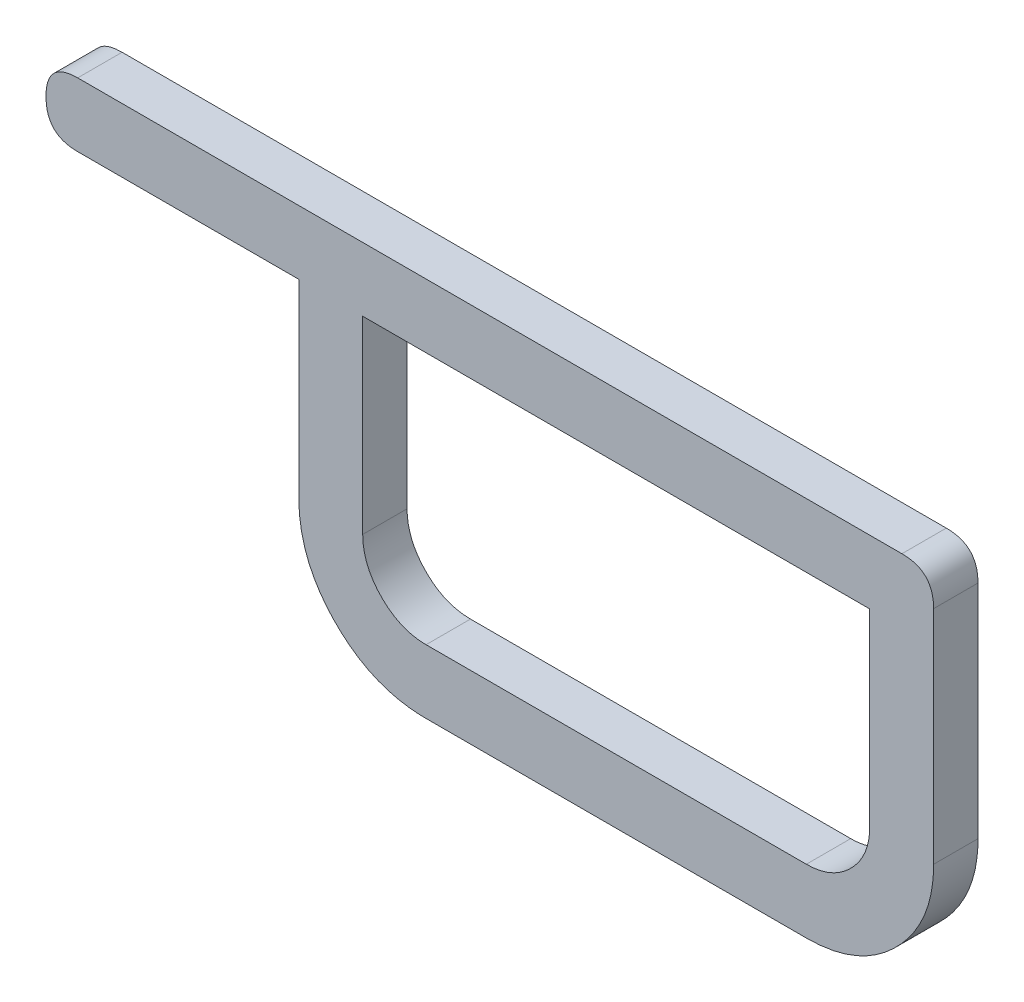
ISO-10303-21;
HEADER;
FILE_DESCRIPTION(('STEP AP214'),'2;1');
FILE_NAME('part.step','',(''),(''),'','','');
FILE_SCHEMA(('AUTOMOTIVE_DESIGN { 1 0 10303 214 1 1 1 1 }'));
ENDSEC;
DATA;
#1=APPLICATION_CONTEXT('core data for automotive mechanical design processes');
#2=APPLICATION_PROTOCOL_DEFINITION('international standard','automotive_design',2000,#1);
#3=PRODUCT_CONTEXT('',#1,'mechanical');
#4=PRODUCT('Part','Part','',(#3));
#5=PRODUCT_RELATED_PRODUCT_CATEGORY('part','',(#4));
#6=PRODUCT_DEFINITION_FORMATION('','',#4);
#7=PRODUCT_DEFINITION_CONTEXT('part definition',#1,'design');
#8=PRODUCT_DEFINITION('design','',#6,#7);
#9=PRODUCT_DEFINITION_SHAPE('','',#8);
#10=(LENGTH_UNIT() NAMED_UNIT(*) SI_UNIT(.MILLI.,.METRE.));
#11=(NAMED_UNIT(*) PLANE_ANGLE_UNIT() SI_UNIT($,.RADIAN.));
#12=(NAMED_UNIT(*) SI_UNIT($,.STERADIAN.) SOLID_ANGLE_UNIT());
#13=UNCERTAINTY_MEASURE_WITH_UNIT(LENGTH_MEASURE(1.E-05),#10,'distance_accuracy_value','');
#14=(GEOMETRIC_REPRESENTATION_CONTEXT(3) GLOBAL_UNCERTAINTY_ASSIGNED_CONTEXT((#13)) GLOBAL_UNIT_ASSIGNED_CONTEXT((#10,
#11,#12)) REPRESENTATION_CONTEXT('',''));
#15=CARTESIAN_POINT('',(0.,0.,0.));
#16=DIRECTION('',(0.,0.,1.));
#17=DIRECTION('',(1.,0.,0.));
#18=AXIS2_PLACEMENT_3D('',#15,#16,#17);
#19=CARTESIAN_POINT('',(0.8,12.2,-2.6));
#20=DIRECTION('',(0.,0.,1.));
#21=DIRECTION('',(1.,0.,0.));
#22=AXIS2_PLACEMENT_3D('',#19,#20,#21);
#23=PLANE('',#22);
#24=CARTESIAN_POINT('',(-2.29855,15.1828,-2.6));
#25=CARTESIAN_POINT('',(-2.37,15.1828,-2.6));
#26=CARTESIAN_POINT('',(-2.37,15.1108,-2.6));
#27=B_SPLINE_CURVE_WITH_KNOTS('',2,(#24,#25,#26),.UNSPECIFIED.,.F.,.F.,(3,3),(0.,1.),.UNSPECIFIED.);
#28=CARTESIAN_POINT('',(-2.29855,15.1828,-2.6));
#29=VERTEX_POINT('',#28);
#30=CARTESIAN_POINT('',(-2.37,15.1108,-2.6));
#31=VERTEX_POINT('',#30);
#32=EDGE_CURVE('E124',#29,#31,#27,.T.);
#33=ORIENTED_EDGE('',*,*,#32,.T.);
#34=CARTESIAN_POINT('',(-2.37,15.1108,-2.6));
#35=CARTESIAN_POINT('',(-2.37,15.0388,-2.6));
#36=CARTESIAN_POINT('',(-2.2988,15.0388,-2.6));
#37=B_SPLINE_CURVE_WITH_KNOTS('',2,(#34,#35,#36),.UNSPECIFIED.,.F.,.F.,(3,3),(0.,1.),.UNSPECIFIED.);
#38=CARTESIAN_POINT('',(-2.2988,15.0388,-2.6));
#39=VERTEX_POINT('',#38);
#40=EDGE_CURVE('E157',#31,#39,#37,.T.);
#41=ORIENTED_EDGE('',*,*,#40,.T.);
#42=DIRECTION('',(1.,0.,0.));
#43=VECTOR('',#42,1.);
#44=CARTESIAN_POINT('',(0.8,15.0388,-2.6));
#45=LINE('',#44,#43);
#46=CARTESIAN_POINT('',(-1.8004,15.0388,-2.6));
#47=VERTEX_POINT('',#46);
#48=EDGE_CURVE('E129',#39,#47,#45,.T.);
#49=ORIENTED_EDGE('',*,*,#48,.T.);
#50=DIRECTION('',(0.,1.,0.));
#51=VECTOR('',#50,1.);
#52=CARTESIAN_POINT('',(-1.8004,15.0388,-2.6));
#53=LINE('',#52,#51);
#54=CARTESIAN_POINT('',(-1.8004,14.61205,-2.6));
#55=VERTEX_POINT('',#54);
#56=EDGE_CURVE('E170',#55,#47,#53,.T.);
#57=ORIENTED_EDGE('',*,*,#56,.F.);
#58=CARTESIAN_POINT('',(-1.8004,14.61205,-2.6));
#59=CARTESIAN_POINT('',(-1.8003998160036,14.6035355597443,-2.6));
#60=CARTESIAN_POINT('',(-1.80008256894422,14.5950214754194,-2.6));
#61=CARTESIAN_POINT('',(-1.79875661173427,14.5780379098975,-2.6));
#62=CARTESIAN_POINT('',(-1.79774707563878,14.5695684941687,-2.6));
#63=CARTESIAN_POINT('',(-1.79361671377079,14.5444567670765,-2.6));
#64=CARTESIAN_POINT('',(-1.78939584211348,14.5279746814634,-2.6));
#65=CARTESIAN_POINT('',(-1.77799965765558,14.4964522412494,-2.6));
#66=CARTESIAN_POINT('',(-1.7708867763884,14.4813892353234,-2.6));
#67=CARTESIAN_POINT('',(-1.75400037887594,14.4528075001893,-2.6));
#68=CARTESIAN_POINT('',(-1.74422244868088,14.4392913862038,-2.6));
#69=CARTESIAN_POINT('',(-1.72840337674099,14.4208366863013,-2.6));
#70=CARTESIAN_POINT('',(-1.72316641905737,14.415181867946,-2.6));
#71=CARTESIAN_POINT('',(-1.71231137329343,14.4042505356049,-2.6));
#72=CARTESIAN_POINT('',(-1.70669329803749,14.398974008902,-2.6));
#73=CARTESIAN_POINT('',(-1.68928089086653,14.3838067764977,-2.6));
#74=CARTESIAN_POINT('',(-1.67691065226227,14.3745575977678,-2.6));
#75=CARTESIAN_POINT('',(-1.64928361736326,14.3573394435046,-2.6));
#76=CARTESIAN_POINT('',(-1.63385850605413,14.3496371992719,-2.6));
#77=CARTESIAN_POINT('',(-1.60179479731174,14.3373848225435,-2.6));
#78=CARTESIAN_POINT('',(-1.58515584095826,14.3328356265779,-2.6));
#79=CARTESIAN_POINT('',(-1.55935251132363,14.3282397918322,-2.6));
#80=CARTESIAN_POINT('',(-1.55036616399614,14.3270814560331,-2.6));
#81=CARTESIAN_POINT('',(-1.53235285673791,14.3255625670696,-2.6));
#82=CARTESIAN_POINT('',(-1.5233261039509,14.3251995940976,-2.6));
#83=CARTESIAN_POINT('',(-1.5143,14.3252,-2.6));
#84=B_SPLINE_CURVE_WITH_KNOTS('',3,(#58,#59,#60,#61,#62,#63,#64,#65,#66,#67,#68,#69,#70,#71,#72,
#73,#74,#75,#76,#77,#78,#79,#80,#81,#82,#83),.UNSPECIFIED.,.F.,.F.,(4,2,2,2,2,2,2,2,2,2,2,2,4),
(0.,0.0255340496383772,0.0510986161469163,0.101824109185629,0.151508242883679,0.201275170586227,
0.224382212820726,0.247488477901438,0.293619747328286,0.345017951748314,0.396431416120824,
0.423583122784671,0.450652107875788),.UNSPECIFIED.);
#85=CARTESIAN_POINT('',(-1.5143,14.3252,-2.6));
#86=VERTEX_POINT('',#85);
#87=EDGE_CURVE('E270',#55,#86,#84,.T.);
#88=ORIENTED_EDGE('',*,*,#87,.T.);
#89=DIRECTION('',(1.,0.,0.));
#90=VECTOR('',#89,1.);
#91=CARTESIAN_POINT('',(-1.5143,14.3252,-2.6));
#92=LINE('',#91,#90);
#93=CARTESIAN_POINT('',(-0.6561,14.3252,-2.6));
#94=VERTEX_POINT('',#93);
#95=EDGE_CURVE('E177',#94,#86,#92,.F.);
#96=ORIENTED_EDGE('',*,*,#95,.F.);
#97=CARTESIAN_POINT('',(-0.6561,14.3252,-2.6));
#98=CARTESIAN_POINT('',(-0.647572778144209,14.3252000561636,-2.6));
#99=CARTESIAN_POINT('',(-0.639045965234395,14.3255268744424,-2.6));
#100=CARTESIAN_POINT('',(-0.622040287620238,14.3268906519721,-2.6));
#101=CARTESIAN_POINT('',(-0.61356148937729,14.3279284279174,-2.6));
#102=CARTESIAN_POINT('',(-0.588450828285685,14.3321664087816,-2.6));
#103=CARTESIAN_POINT('',(-0.571987246050862,14.3364893415332,-2.6));
#104=CARTESIAN_POINT('',(-0.540854638533254,14.3479931581922,-2.6));
#105=CARTESIAN_POINT('',(-0.526139983185674,14.3550515171116,-2.6));
#106=CARTESIAN_POINT('',(-0.498196401099325,14.3717120449372,-2.6));
#107=CARTESIAN_POINT('',(-0.484970414481213,14.3813191262286,-2.6));
#108=CARTESIAN_POINT('',(-0.466758998753157,14.3969179668463,-2.6));
#109=CARTESIAN_POINT('',(-0.461099700776292,14.4021517908307,-2.6));
#110=CARTESIAN_POINT('',(-0.450154257282062,14.4129963292577,-2.6));
#111=CARTESIAN_POINT('',(-0.444868107967848,14.4186070398644,-2.6));
#112=CARTESIAN_POINT('',(-0.429658261759615,14.4359890799039,-2.6));
#113=CARTESIAN_POINT('',(-0.420363424120729,14.4483271404886,-2.6));
#114=CARTESIAN_POINT('',(-0.402876913546391,14.4760929428489,-2.6));
#115=CARTESIAN_POINT('',(-0.394987516400341,14.4917137670461,-2.6));
#116=CARTESIAN_POINT('',(-0.382434218897972,14.5242094111531,-2.6));
#117=CARTESIAN_POINT('',(-0.377770783844724,14.5410844115728,-2.6));
#118=CARTESIAN_POINT('',(-0.373084941673606,14.5671829030551,-2.6));
#119=CARTESIAN_POINT('',(-0.37190991526476,14.5762202778483,-2.6));
#120=CARTESIAN_POINT('',(-0.370368361466423,14.594338737871,-2.6));
#121=CARTESIAN_POINT('',(-0.369999534545718,14.6034196245429,-2.6));
#122=CARTESIAN_POINT('',(-0.37,14.6125,-2.6));
#123=B_SPLINE_CURVE_WITH_KNOTS('',3,(#97,#98,#99,#100,#101,#102,#103,#104,#105,#106,#107,#108,
#109,#110,#111,#112,#113,#114,#115,#116,#117,#118,#119,#120,#121,#122),.UNSPECIFIED.,.F.,.F.,(4,
2,2,2,2,2,2,2,2,2,2,2,4),(0.,0.0255718736627873,0.0511731717271448,0.10190976679518,
0.15059647618004,0.199377714371063,0.222488408395358,0.245598867230646,0.291742676741532,
0.343908506876982,0.396081859686895,0.423391183850599,0.450622511140521),.UNSPECIFIED.);
#124=CARTESIAN_POINT('',(-0.37,14.6125,-2.6));
#125=VERTEX_POINT('',#124);
#126=EDGE_CURVE('E293',#94,#125,#123,.T.);
#127=ORIENTED_EDGE('',*,*,#126,.T.);
#128=DIRECTION('',(0.,1.,0.));
#129=VECTOR('',#128,1.);
#130=CARTESIAN_POINT('',(-0.37,14.6125,-2.6));
#131=LINE('',#130,#129);
#132=CARTESIAN_POINT('',(-0.37,15.11135,-2.6));
#133=VERTEX_POINT('',#132);
#134=EDGE_CURVE('E298',#133,#125,#131,.F.);
#135=ORIENTED_EDGE('',*,*,#134,.F.);
#136=CARTESIAN_POINT('',(-0.37,15.11135,-2.6));
#137=CARTESIAN_POINT('',(-0.37,15.1828,-2.6));
#138=CARTESIAN_POINT('',(-0.44145,15.1828,-2.6));
#139=B_SPLINE_CURVE_WITH_KNOTS('',2,(#136,#137,#138),.UNSPECIFIED.,.F.,.F.,(3,3),(0.,1.),.UNSPECIFIED.);
#140=CARTESIAN_POINT('',(-0.44145,15.1828,-2.6));
#141=VERTEX_POINT('',#140);
#142=EDGE_CURVE('E287',#133,#141,#139,.T.);
#143=ORIENTED_EDGE('',*,*,#142,.T.);
#144=DIRECTION('',(1.,0.,0.));
#145=VECTOR('',#144,1.);
#146=CARTESIAN_POINT('',(-0.44145,15.1828,-2.6));
#147=LINE('',#146,#145);
#148=EDGE_CURVE('E330',#29,#141,#147,.T.);
#149=ORIENTED_EDGE('',*,*,#148,.F.);
#150=EDGE_LOOP('',(#33,#41,#49,#57,#88,#96,#127,#135,#143,#149));
#151=FACE_BOUND('',#150,.T.);
#152=DIRECTION('',(1.,0.,0.));
#153=VECTOR('',#152,1.);
#154=CARTESIAN_POINT('',(-0.6568,14.4692,-2.6));
#155=LINE('',#154,#153);
#156=CARTESIAN_POINT('',(-0.6568,14.4692,-2.6));
#157=VERTEX_POINT('',#156);
#158=CARTESIAN_POINT('',(-1.5136,14.4692,-2.6));
#159=VERTEX_POINT('',#158);
#160=EDGE_CURVE('E183',#157,#159,#155,.F.);
#161=ORIENTED_EDGE('',*,*,#160,.T.);
#162=CARTESIAN_POINT('',(-1.6564,14.613,-2.6));
#163=CARTESIAN_POINT('',(-1.65643513674415,14.6044647302951,-2.6));
#164=CARTESIAN_POINT('',(-1.65572803096606,14.5959057944378,-2.6));
#165=CARTESIAN_POINT('',(-1.65280284789136,14.5791376703585,-2.6));
#166=CARTESIAN_POINT('',(-1.65059927865323,14.5709259209587,-2.6));
#167=CARTESIAN_POINT('',(-1.64482017390128,14.5555100075264,-2.6));
#168=CARTESIAN_POINT('',(-1.64132676290647,14.5482752668035,-2.6));
#169=CARTESIAN_POINT('',(-1.6331390104382,14.5345057855089,-2.6));
#170=CARTESIAN_POINT('',(-1.62844129241897,14.5279730875755,-2.6));
#171=CARTESIAN_POINT('',(-1.61820179251674,14.51574075117,-2.6));
#172=CARTESIAN_POINT('',(-1.61266989787803,14.5100327146888,-2.6));
#173=CARTESIAN_POINT('',(-1.60084315572948,14.4994804329752,-2.6));
#174=CARTESIAN_POINT('',(-1.59454972690608,14.4946346218622,-2.6));
#175=CARTESIAN_POINT('',(-1.58157785899682,14.4863282206529,-2.6));
#176=CARTESIAN_POINT('',(-1.57493898512848,14.4828066181307,-2.6));
#177=CARTESIAN_POINT('',(-1.56115162547525,14.4769572020059,-2.6));
#178=CARTESIAN_POINT('',(-1.55400313022343,14.4746294105865,-2.6));
#179=CARTESIAN_POINT('',(-1.54129354071733,14.4716451266859,-2.6));
#180=CARTESIAN_POINT('',(-1.53579427650218,14.4707134004504,-2.6));
#181=CARTESIAN_POINT('',(-1.52472830693292,14.4694891756846,-2.6));
#182=CARTESIAN_POINT('',(-1.51916165655574,14.4691961872936,-2.6));
#183=CARTESIAN_POINT('',(-1.5136,14.4692,-2.6));
#184=B_SPLINE_CURVE_WITH_KNOTS('',3,(#162,#163,#164,#165,#166,#167,#168,#169,#170,#171,#172,
#173,#174,#175,#176,#177,#178,#179,#180,#181,#182,#183),.UNSPECIFIED.,.F.,.F.,(4,2,2,2,2,2,2,2,
2,2,4),(0.,0.0256082379951683,0.0509716856621924,0.0749401346436853,0.0989765338777531,
0.122747667284913,0.146475179423879,0.168912000572327,0.191349238624935,0.20804556643246,
0.224729084981592),.UNSPECIFIED.);
#185=CARTESIAN_POINT('',(-1.6564,14.613,-2.6));
#186=VERTEX_POINT('',#185);
#187=EDGE_CURVE('E169',#186,#159,#184,.T.);
#188=ORIENTED_EDGE('',*,*,#187,.F.);
#189=DIRECTION('',(0.,1.,0.));
#190=VECTOR('',#189,1.);
#191=CARTESIAN_POINT('',(-1.6564,14.613,-2.6));
#192=LINE('',#191,#190);
#193=CARTESIAN_POINT('',(-1.6564,15.0388,-2.6));
#194=VERTEX_POINT('',#193);
#195=EDGE_CURVE('E162',#186,#194,#192,.T.);
#196=ORIENTED_EDGE('',*,*,#195,.T.);
#197=DIRECTION('',(1.,0.,0.));
#198=VECTOR('',#197,1.);
#199=CARTESIAN_POINT('',(-1.6564,15.0388,-2.6));
#200=LINE('',#199,#198);
#201=CARTESIAN_POINT('',(-0.514,15.0388,-2.6));
#202=VERTEX_POINT('',#201);
#203=EDGE_CURVE('E147',#194,#202,#200,.T.);
#204=ORIENTED_EDGE('',*,*,#203,.T.);
#205=DIRECTION('',(0.,1.,0.));
#206=VECTOR('',#205,1.);
#207=CARTESIAN_POINT('',(-0.514,15.0388,-2.6));
#208=LINE('',#207,#206);
#209=CARTESIAN_POINT('',(-0.514,14.613,-2.6));
#210=VERTEX_POINT('',#209);
#211=EDGE_CURVE('E186',#202,#210,#208,.F.);
#212=ORIENTED_EDGE('',*,*,#211,.T.);
#213=CARTESIAN_POINT('',(-0.6568,14.4692,-2.6));
#214=CARTESIAN_POINT('',(-0.648261517372487,14.4691635336351,-2.6));
#215=CARTESIAN_POINT('',(-0.639696075160038,14.4698772336722,-2.6));
#216=CARTESIAN_POINT('',(-0.62292324950456,14.4728395746125,-2.6));
#217=CARTESIAN_POINT('',(-0.614713219379232,14.4750734246304,-2.6));
#218=CARTESIAN_POINT('',(-0.59943195082938,14.4809003734663,-2.6));
#219=CARTESIAN_POINT('',(-0.592321224441758,14.484389226148,-2.6));
#220=CARTESIAN_POINT('',(-0.578806190092339,14.492553156327,-2.6));
#221=CARTESIAN_POINT('',(-0.57240356957183,14.497230983348,-2.6));
#222=CARTESIAN_POINT('',(-0.560497359652889,14.5073775542678,-2.6));
#223=CARTESIAN_POINT('',(-0.554978076537108,14.5128281890234,-2.6));
#224=CARTESIAN_POINT('',(-0.544738458427463,14.52443247426,-2.6));
#225=CARTESIAN_POINT('',(-0.54001756732528,14.5305856303642,-2.6));
#226=CARTESIAN_POINT('',(-0.530951587709443,14.5446626759407,-2.6));
#227=CARTESIAN_POINT('',(-0.52679550128536,14.5527114190509,-2.6));
#228=CARTESIAN_POINT('',(-0.520209179505941,14.5694851152444,-2.6));
#229=CARTESIAN_POINT('',(-0.517777864903136,14.5782096416692,-2.6));
#230=CARTESIAN_POINT('',(-0.515457053607278,14.5913544034326,-2.6));
#231=CARTESIAN_POINT('',(-0.514903311253143,14.5956697180538,-2.6));
#232=CARTESIAN_POINT('',(-0.51417515471615,14.604323295216,-2.6));
#233=CARTESIAN_POINT('',(-0.513999926399915,14.608661488346,-2.6));
#234=CARTESIAN_POINT('',(-0.514,14.613,-2.6));
#235=B_SPLINE_CURVE_WITH_KNOTS('',3,(#213,#214,#215,#216,#217,#218,#219,#220,#221,#222,#223,
#224,#225,#226,#227,#228,#229,#230,#231,#232,#233,#234),.UNSPECIFIED.,.F.,.F.,(4,2,2,2,2,2,2,2,
2,2,4),(0.,0.0256224354924312,0.0509990663769163,0.0746274096820793,0.0983108991317701,
0.121510576926791,0.144694028168843,0.171684350607085,0.1986577693644,0.211695834556979,
0.224705828565297),.UNSPECIFIED.);
#236=EDGE_CURVE('E23',#157,#210,#235,.T.);
#237=ORIENTED_EDGE('',*,*,#236,.F.);
#238=EDGE_LOOP('',(#161,#188,#196,#204,#212,#237));
#239=FACE_BOUND('',#238,.T.);
#240=ADVANCED_FACE('F17',(#151,#239),#23,.T.);
#241=CARTESIAN_POINT('',(-1.6564,15.0388,-2.7));
#242=DIRECTION('',(0.,1.,0.));
#243=DIRECTION('',(0.,0.,1.));
#244=AXIS2_PLACEMENT_3D('',#241,#242,#243);
#245=PLANE('',#244);
#246=DIRECTION('',(0.,0.,1.));
#247=VECTOR('',#246,1.);
#248=CARTESIAN_POINT('',(-1.6564,15.0388,-2.7));
#249=LINE('',#248,#247);
#250=CARTESIAN_POINT('',(-1.6564,15.0388,-2.7));
#251=VERTEX_POINT('',#250);
#252=EDGE_CURVE('E150',#194,#251,#249,.F.);
#253=ORIENTED_EDGE('',*,*,#252,.T.);
#254=DIRECTION('',(1.,0.,0.));
#255=VECTOR('',#254,1.);
#256=CARTESIAN_POINT('',(0.8,15.0388,-2.7));
#257=LINE('',#256,#255);
#258=CARTESIAN_POINT('',(-0.514,15.0388,-2.7));
#259=VERTEX_POINT('',#258);
#260=EDGE_CURVE('E137',#251,#259,#257,.T.);
#261=ORIENTED_EDGE('',*,*,#260,.T.);
#262=DIRECTION('',(0.,0.,-1.));
#263=VECTOR('',#262,1.);
#264=CARTESIAN_POINT('',(-0.514,15.0388,-2.7));
#265=LINE('',#264,#263);
#266=EDGE_CURVE('E152',#259,#202,#265,.F.);
#267=ORIENTED_EDGE('',*,*,#266,.T.);
#268=ORIENTED_EDGE('',*,*,#203,.F.);
#269=EDGE_LOOP('',(#253,#261,#267,#268));
#270=FACE_BOUND('',#269,.T.);
#271=ADVANCED_FACE('F149',(#270),#245,.F.);
#272=CARTESIAN_POINT('',(-0.514,15.0388,-2.7));
#273=DIRECTION('',(1.,0.,0.));
#274=DIRECTION('',(0.,0.,-1.));
#275=AXIS2_PLACEMENT_3D('',#272,#273,#274);
#276=PLANE('',#275);
#277=ORIENTED_EDGE('',*,*,#266,.F.);
#278=DIRECTION('',(0.,1.,0.));
#279=VECTOR('',#278,1.);
#280=CARTESIAN_POINT('',(-0.514,12.2,-2.7));
#281=LINE('',#280,#279);
#282=CARTESIAN_POINT('',(-0.514,14.613,-2.7));
#283=VERTEX_POINT('',#282);
#284=EDGE_CURVE('E317',#259,#283,#281,.F.);
#285=ORIENTED_EDGE('',*,*,#284,.T.);
#286=DIRECTION('',(0.,0.,-1.));
#287=VECTOR('',#286,1.);
#288=CARTESIAN_POINT('',(-0.514,14.613,-2.65));
#289=LINE('',#288,#287);
#290=EDGE_CURVE('E324',#210,#283,#289,.T.);
#291=ORIENTED_EDGE('',*,*,#290,.F.);
#292=ORIENTED_EDGE('',*,*,#211,.F.);
#293=EDGE_LOOP('',(#277,#285,#291,#292));
#294=FACE_BOUND('',#293,.T.);
#295=ADVANCED_FACE('F420',(#294),#276,.F.);
#296=CARTESIAN_POINT('',(-0.6568,14.4692,-2.7));
#297=CARTESIAN_POINT('',(-0.59825,14.4692,-2.7));
#298=CARTESIAN_POINT('',(-0.514,14.55465,-2.7));
#299=CARTESIAN_POINT('',(-0.514,14.613,-2.7));
#300=CARTESIAN_POINT('',(-0.6568,14.4692,-2.6));
#301=CARTESIAN_POINT('',(-0.59825,14.4692,-2.6));
#302=CARTESIAN_POINT('',(-0.514,14.55465,-2.6));
#303=CARTESIAN_POINT('',(-0.514,14.613,-2.6));
#304=B_SPLINE_SURFACE_WITH_KNOTS('',1,2,((#296,#297,#298,#299),(#300,#301,#302,#303)),
.UNSPECIFIED.,.F.,.F.,.F.,(2,2),(3,1,3),(0.,1.),(0.,0.5,1.),.UNSPECIFIED.);
#305=CARTESIAN_POINT('',(-0.514,14.613,-2.7));
#306=CARTESIAN_POINT('',(-0.513964863255855,14.6044647302951,-2.7));
#307=CARTESIAN_POINT('',(-0.514671969033945,14.5959057944378,-2.7));
#308=CARTESIAN_POINT('',(-0.517597152108643,14.5791376703585,-2.7));
#309=CARTESIAN_POINT('',(-0.519800721346766,14.5709259209587,-2.7));
#310=CARTESIAN_POINT('',(-0.525579826098716,14.5555100075264,-2.7));
#311=CARTESIAN_POINT('',(-0.529073237093529,14.5482752668035,-2.7));
#312=CARTESIAN_POINT('',(-0.537260989561797,14.5345057855089,-2.7));
#313=CARTESIAN_POINT('',(-0.541958707581032,14.5279730875755,-2.7));
#314=CARTESIAN_POINT('',(-0.55219820748326,14.51574075117,-2.7));
#315=CARTESIAN_POINT('',(-0.557730102121966,14.5100327146888,-2.7));
#316=CARTESIAN_POINT('',(-0.569556844270525,14.4994804329752,-2.7));
#317=CARTESIAN_POINT('',(-0.575850273093921,14.4946346218622,-2.7));
#318=CARTESIAN_POINT('',(-0.588822141003186,14.4863282206529,-2.7));
#319=CARTESIAN_POINT('',(-0.595461014871526,14.4828066181307,-2.7));
#320=CARTESIAN_POINT('',(-0.60924837452475,14.4769572020059,-2.7));
#321=CARTESIAN_POINT('',(-0.616396869776567,14.4746294105865,-2.7));
#322=CARTESIAN_POINT('',(-0.629106459282669,14.4716451266859,-2.7));
#323=CARTESIAN_POINT('',(-0.634605723497818,14.4707134004504,-2.7));
#324=CARTESIAN_POINT('',(-0.645671693067083,14.4694891756847,-2.7));
#325=CARTESIAN_POINT('',(-0.651238343444259,14.4691961872936,-2.7));
#326=CARTESIAN_POINT('',(-0.6568,14.4692,-2.7));
#327=B_SPLINE_CURVE_WITH_KNOTS('',3,(#305,#306,#307,#308,#309,#310,#311,#312,#313,#314,#315,
#316,#317,#318,#319,#320,#321,#322,#323,#324,#325,#326),.UNSPECIFIED.,.F.,.F.,(4,2,2,2,2,2,2,2,
2,2,4),(0.,0.0256082379951684,0.0509716856621922,0.0749401346436842,0.0989765338777524,
0.122747667284915,0.146475179423882,0.168912000572329,0.191349238624936,0.208045566432461,
0.224729084981591),.UNSPECIFIED.);
#328=CARTESIAN_POINT('',(-0.6568,14.4692,-2.7));
#329=VERTEX_POINT('',#328);
#330=EDGE_CURVE('E240',#283,#329,#327,.T.);
#331=DIRECTION('',(0.,0.,-1.));
#332=VECTOR('',#331,1.);
#333=CARTESIAN_POINT('',(-0.6568,14.4692,-2.7));
#334=LINE('',#333,#332);
#335=EDGE_CURVE('E185',#329,#157,#334,.F.);
#336=ORIENTED_EDGE('',*,*,#330,.T.);
#337=ORIENTED_EDGE('',*,*,#335,.T.);
#338=ORIENTED_EDGE('',*,*,#236,.T.);
#339=ORIENTED_EDGE('',*,*,#290,.T.);
#340=EDGE_LOOP('',(#336,#337,#338,#339));
#341=FACE_BOUND('',#340,.T.);
#342=ADVANCED_FACE('F252',(#341),#304,.T.);
#343=CARTESIAN_POINT('',(-0.6568,14.4692,-2.7));
#344=DIRECTION('',(0.,-1.,0.));
#345=DIRECTION('',(0.,0.,-1.));
#346=AXIS2_PLACEMENT_3D('',#343,#344,#345);
#347=PLANE('',#346);
#348=ORIENTED_EDGE('',*,*,#335,.F.);
#349=DIRECTION('',(1.,0.,0.));
#350=VECTOR('',#349,1.);
#351=CARTESIAN_POINT('',(0.8,14.4692,-2.7));
#352=LINE('',#351,#350);
#353=CARTESIAN_POINT('',(-1.5136,14.4692,-2.7));
#354=VERTEX_POINT('',#353);
#355=EDGE_CURVE('E239',#329,#354,#352,.F.);
#356=ORIENTED_EDGE('',*,*,#355,.T.);
#357=DIRECTION('',(0.,0.,-1.));
#358=VECTOR('',#357,1.);
#359=CARTESIAN_POINT('',(-1.5136,14.4692,-2.65));
#360=LINE('',#359,#358);
#361=EDGE_CURVE('E166',#159,#354,#360,.T.);
#362=ORIENTED_EDGE('',*,*,#361,.F.);
#363=ORIENTED_EDGE('',*,*,#160,.F.);
#364=EDGE_LOOP('',(#348,#356,#362,#363));
#365=FACE_BOUND('',#364,.T.);
#366=ADVANCED_FACE('F250',(#365),#347,.F.);
#367=CARTESIAN_POINT('',(-1.6564,14.613,-2.7));
#368=CARTESIAN_POINT('',(-1.6564,14.55465,-2.7));
#369=CARTESIAN_POINT('',(-1.57215,14.4692,-2.7));
#370=CARTESIAN_POINT('',(-1.5136,14.4692,-2.7));
#371=CARTESIAN_POINT('',(-1.6564,14.613,-2.6));
#372=CARTESIAN_POINT('',(-1.6564,14.55465,-2.6));
#373=CARTESIAN_POINT('',(-1.57215,14.4692,-2.6));
#374=CARTESIAN_POINT('',(-1.5136,14.4692,-2.6));
#375=B_SPLINE_SURFACE_WITH_KNOTS('',1,2,((#367,#368,#369,#370),(#371,#372,#373,#374)),
.UNSPECIFIED.,.F.,.F.,.F.,(2,2),(3,1,3),(0.,1.),(0.,0.5,1.),.UNSPECIFIED.);
#376=CARTESIAN_POINT('',(-1.5136,14.4692,-2.7));
#377=CARTESIAN_POINT('',(-1.52213848262751,14.4691635336351,-2.7));
#378=CARTESIAN_POINT('',(-1.53070392483996,14.4698772336722,-2.7));
#379=CARTESIAN_POINT('',(-1.54747675049544,14.4728395746125,-2.7));
#380=CARTESIAN_POINT('',(-1.55568678062077,14.4750734246304,-2.7));
#381=CARTESIAN_POINT('',(-1.57096804917062,14.4809003734663,-2.7));
#382=CARTESIAN_POINT('',(-1.57807877555824,14.484389226148,-2.7));
#383=CARTESIAN_POINT('',(-1.59159380990767,14.492553156327,-2.7));
#384=CARTESIAN_POINT('',(-1.59799643042818,14.497230983348,-2.7));
#385=CARTESIAN_POINT('',(-1.60990264034712,14.5073775542678,-2.7));
#386=CARTESIAN_POINT('',(-1.61542192346289,14.5128281890234,-2.7));
#387=CARTESIAN_POINT('',(-1.62566154157254,14.52443247426,-2.7));
#388=CARTESIAN_POINT('',(-1.63038243267472,14.5305856303642,-2.7));
#389=CARTESIAN_POINT('',(-1.63944841229056,14.5446626759407,-2.7));
#390=CARTESIAN_POINT('',(-1.64360449871464,14.5527114190509,-2.7));
#391=CARTESIAN_POINT('',(-1.65019082049406,14.5694851152444,-2.7));
#392=CARTESIAN_POINT('',(-1.65262213509687,14.5782096416692,-2.7));
#393=CARTESIAN_POINT('',(-1.65494294639272,14.5913544034326,-2.7));
#394=CARTESIAN_POINT('',(-1.65549668874686,14.5956697180538,-2.7));
#395=CARTESIAN_POINT('',(-1.65622484528385,14.604323295216,-2.7));
#396=CARTESIAN_POINT('',(-1.65640007360008,14.608661488346,-2.7));
#397=CARTESIAN_POINT('',(-1.6564,14.613,-2.7));
#398=B_SPLINE_CURVE_WITH_KNOTS('',3,(#376,#377,#378,#379,#380,#381,#382,#383,#384,#385,#386,
#387,#388,#389,#390,#391,#392,#393,#394,#395,#396,#397),.UNSPECIFIED.,.F.,.F.,(4,2,2,2,2,2,2,2,
2,2,4),(0.,0.0256224354924312,0.050999066376916,0.074627409682083,0.0983108991317772,
0.121510576926796,0.144694028168843,0.171684350607084,0.198657769364398,0.211695834556976,
0.224705828565295),.UNSPECIFIED.);
#399=CARTESIAN_POINT('',(-1.6564,14.613,-2.7));
#400=VERTEX_POINT('',#399);
#401=EDGE_CURVE('E233',#354,#400,#398,.T.);
#402=DIRECTION('',(0.,0.,1.));
#403=VECTOR('',#402,1.);
#404=CARTESIAN_POINT('',(-1.6564,14.613,-2.7));
#405=LINE('',#404,#403);
#406=EDGE_CURVE('E165',#400,#186,#405,.T.);
#407=ORIENTED_EDGE('',*,*,#401,.T.);
#408=ORIENTED_EDGE('',*,*,#406,.T.);
#409=ORIENTED_EDGE('',*,*,#187,.T.);
#410=ORIENTED_EDGE('',*,*,#361,.T.);
#411=EDGE_LOOP('',(#407,#408,#409,#410));
#412=FACE_BOUND('',#411,.T.);
#413=ADVANCED_FACE('F245',(#412),#375,.T.);
#414=CARTESIAN_POINT('',(-1.6564,14.613,-2.7));
#415=DIRECTION('',(-1.,0.,0.));
#416=DIRECTION('',(0.,0.,1.));
#417=AXIS2_PLACEMENT_3D('',#414,#415,#416);
#418=PLANE('',#417);
#419=ORIENTED_EDGE('',*,*,#406,.F.);
#420=DIRECTION('',(0.,1.,0.));
#421=VECTOR('',#420,1.);
#422=CARTESIAN_POINT('',(-1.6564,12.2,-2.7));
#423=LINE('',#422,#421);
#424=EDGE_CURVE('E164',#400,#251,#423,.T.);
#425=ORIENTED_EDGE('',*,*,#424,.T.);
#426=ORIENTED_EDGE('',*,*,#252,.F.);
#427=ORIENTED_EDGE('',*,*,#195,.F.);
#428=EDGE_LOOP('',(#419,#425,#426,#427));
#429=FACE_BOUND('',#428,.T.);
#430=ADVANCED_FACE('F161',(#429),#418,.F.);
#431=CARTESIAN_POINT('',(-1.8004,15.0388,-2.7));
#432=DIRECTION('',(-1.,0.,0.));
#433=DIRECTION('',(0.,0.,1.));
#434=AXIS2_PLACEMENT_3D('',#431,#432,#433);
#435=PLANE('',#434);
#436=DIRECTION('',(0.,1.,0.));
#437=VECTOR('',#436,1.);
#438=CARTESIAN_POINT('',(-1.8004,12.2,-2.7));
#439=LINE('',#438,#437);
#440=CARTESIAN_POINT('',(-1.8004,15.0388,-2.7));
#441=VERTEX_POINT('',#440);
#442=CARTESIAN_POINT('',(-1.8004,14.61205,-2.7));
#443=VERTEX_POINT('',#442);
#444=EDGE_CURVE('E361',#441,#443,#439,.F.);
#445=ORIENTED_EDGE('',*,*,#444,.T.);
#446=DIRECTION('',(0.,0.,1.));
#447=VECTOR('',#446,1.);
#448=CARTESIAN_POINT('',(-1.8004,14.61205,-2.65));
#449=LINE('',#448,#447);
#450=EDGE_CURVE('E172',#443,#55,#449,.T.);
#451=ORIENTED_EDGE('',*,*,#450,.T.);
#452=ORIENTED_EDGE('',*,*,#56,.T.);
#453=DIRECTION('',(0.,0.,-1.));
#454=VECTOR('',#453,1.);
#455=CARTESIAN_POINT('',(-1.8004,15.0388,-2.7));
#456=LINE('',#455,#454);
#457=EDGE_CURVE('E318',#441,#47,#456,.F.);
#458=ORIENTED_EDGE('',*,*,#457,.F.);
#459=EDGE_LOOP('',(#445,#451,#452,#458));
#460=FACE_BOUND('',#459,.T.);
#461=ADVANCED_FACE('F395',(#460),#435,.T.);
#462=CARTESIAN_POINT('',(-1.8004,14.61205,-2.7));
#463=CARTESIAN_POINT('',(-1.8004,14.4922,-2.7));
#464=CARTESIAN_POINT('',(-1.63305,14.3252,-2.7));
#465=CARTESIAN_POINT('',(-1.5143,14.3252,-2.7));
#466=CARTESIAN_POINT('',(-1.8004,14.61205,-2.6));
#467=CARTESIAN_POINT('',(-1.8004,14.4922,-2.6));
#468=CARTESIAN_POINT('',(-1.63305,14.3252,-2.6));
#469=CARTESIAN_POINT('',(-1.5143,14.3252,-2.6));
#470=B_SPLINE_SURFACE_WITH_KNOTS('',1,2,((#462,#463,#464,#465),(#466,#467,#468,#469)),
.UNSPECIFIED.,.F.,.F.,.F.,(2,2),(3,1,3),(0.,1.),(0.,0.5,1.),.UNSPECIFIED.);
#471=CARTESIAN_POINT('',(-1.8004,14.61205,-2.7));
#472=CARTESIAN_POINT('',(-1.8003998160036,14.6035355597443,-2.7));
#473=CARTESIAN_POINT('',(-1.80008256894422,14.5950214754194,-2.7));
#474=CARTESIAN_POINT('',(-1.79875661173427,14.5780379098975,-2.7));
#475=CARTESIAN_POINT('',(-1.79774707563878,14.5695684941687,-2.7));
#476=CARTESIAN_POINT('',(-1.79361671377079,14.5444567670765,-2.7));
#477=CARTESIAN_POINT('',(-1.78939584211348,14.5279746814634,-2.7));
#478=CARTESIAN_POINT('',(-1.77799965765558,14.4964522412494,-2.7));
#479=CARTESIAN_POINT('',(-1.7708867763884,14.4813892353234,-2.7));
#480=CARTESIAN_POINT('',(-1.75400037887594,14.4528075001893,-2.7));
#481=CARTESIAN_POINT('',(-1.74422244868088,14.4392913862038,-2.7));
#482=CARTESIAN_POINT('',(-1.72840337674099,14.4208366863013,-2.7));
#483=CARTESIAN_POINT('',(-1.72316641905737,14.415181867946,-2.7));
#484=CARTESIAN_POINT('',(-1.71231137329342,14.4042505356049,-2.7));
#485=CARTESIAN_POINT('',(-1.70669329803749,14.398974008902,-2.7));
#486=CARTESIAN_POINT('',(-1.68928089086653,14.3838067764977,-2.7));
#487=CARTESIAN_POINT('',(-1.67691065226227,14.3745575977678,-2.7));
#488=CARTESIAN_POINT('',(-1.64928361736326,14.3573394435046,-2.7));
#489=CARTESIAN_POINT('',(-1.63385850605413,14.3496371992719,-2.7));
#490=CARTESIAN_POINT('',(-1.60179479731174,14.3373848225435,-2.7));
#491=CARTESIAN_POINT('',(-1.58515584095826,14.3328356265779,-2.7));
#492=CARTESIAN_POINT('',(-1.55935251132363,14.3282397918322,-2.7));
#493=CARTESIAN_POINT('',(-1.55036616399614,14.3270814560331,-2.7));
#494=CARTESIAN_POINT('',(-1.53235285673791,14.3255625670696,-2.7));
#495=CARTESIAN_POINT('',(-1.5233261039509,14.3251995940976,-2.7));
#496=CARTESIAN_POINT('',(-1.5143,14.3252,-2.7));
#497=B_SPLINE_CURVE_WITH_KNOTS('',3,(#471,#472,#473,#474,#475,#476,#477,#478,#479,#480,#481,
#482,#483,#484,#485,#486,#487,#488,#489,#490,#491,#492,#493,#494,#495,#496),.UNSPECIFIED.,.F.,
.F.,(4,2,2,2,2,2,2,2,2,2,2,2,4),(0.,0.0255340496383772,0.0510986161469163,0.101824109185629,
0.151508242883678,0.201275170586227,0.224382212820726,0.247488477901436,0.293619747328285,
0.345017951748313,0.396431416120823,0.42358312278467,0.450652107875787),.UNSPECIFIED.);
#498=CARTESIAN_POINT('',(-1.5143,14.3252,-2.7));
#499=VERTEX_POINT('',#498);
#500=EDGE_CURVE('E200',#443,#499,#497,.T.);
#501=DIRECTION('',(0.,0.,-1.));
#502=VECTOR('',#501,1.);
#503=CARTESIAN_POINT('',(-1.5143,14.3252,-2.7));
#504=LINE('',#503,#502);
#505=EDGE_CURVE('E304',#86,#499,#504,.T.);
#506=ORIENTED_EDGE('',*,*,#450,.F.);
#507=ORIENTED_EDGE('',*,*,#500,.T.);
#508=ORIENTED_EDGE('',*,*,#505,.F.);
#509=ORIENTED_EDGE('',*,*,#87,.F.);
#510=EDGE_LOOP('',(#506,#507,#508,#509));
#511=FACE_BOUND('',#510,.T.);
#512=ADVANCED_FACE('F256',(#511),#470,.F.);
#513=CARTESIAN_POINT('',(-1.5143,14.3252,-2.7));
#514=DIRECTION('',(0.,-1.,0.));
#515=DIRECTION('',(0.,0.,-1.));
#516=AXIS2_PLACEMENT_3D('',#513,#514,#515);
#517=PLANE('',#516);
#518=DIRECTION('',(1.,0.,0.));
#519=VECTOR('',#518,1.);
#520=CARTESIAN_POINT('',(0.8,14.3252,-2.7));
#521=LINE('',#520,#519);
#522=CARTESIAN_POINT('',(-0.6561,14.3252,-2.7));
#523=VERTEX_POINT('',#522);
#524=EDGE_CURVE('E199',#499,#523,#521,.T.);
#525=ORIENTED_EDGE('',*,*,#524,.T.);
#526=DIRECTION('',(0.,0.,1.));
#527=VECTOR('',#526,1.);
#528=CARTESIAN_POINT('',(-0.6561,14.3252,-2.65));
#529=LINE('',#528,#527);
#530=EDGE_CURVE('E299',#523,#94,#529,.T.);
#531=ORIENTED_EDGE('',*,*,#530,.T.);
#532=ORIENTED_EDGE('',*,*,#95,.T.);
#533=ORIENTED_EDGE('',*,*,#505,.T.);
#534=EDGE_LOOP('',(#525,#531,#532,#533));
#535=FACE_BOUND('',#534,.T.);
#536=ADVANCED_FACE('F387',(#535),#517,.T.);
#537=CARTESIAN_POINT('',(-0.6561,14.3252,-2.7));
#538=CARTESIAN_POINT('',(-0.53735,14.3252,-2.7));
#539=CARTESIAN_POINT('',(-0.37,14.49385,-2.7));
#540=CARTESIAN_POINT('',(-0.37,14.6125,-2.7));
#541=CARTESIAN_POINT('',(-0.6561,14.3252,-2.6));
#542=CARTESIAN_POINT('',(-0.53735,14.3252,-2.6));
#543=CARTESIAN_POINT('',(-0.37,14.49385,-2.6));
#544=CARTESIAN_POINT('',(-0.37,14.6125,-2.6));
#545=B_SPLINE_SURFACE_WITH_KNOTS('',1,2,((#537,#538,#539,#540),(#541,#542,#543,#544)),
.UNSPECIFIED.,.F.,.F.,.F.,(2,2),(3,1,3),(0.,1.),(0.,0.5,1.),.UNSPECIFIED.);
#546=CARTESIAN_POINT('',(-0.6561,14.3252,-2.7));
#547=CARTESIAN_POINT('',(-0.647572778144209,14.3252000561636,-2.7));
#548=CARTESIAN_POINT('',(-0.639045965234395,14.3255268744424,-2.7));
#549=CARTESIAN_POINT('',(-0.622040287620238,14.3268906519721,-2.7));
#550=CARTESIAN_POINT('',(-0.61356148937729,14.3279284279174,-2.7));
#551=CARTESIAN_POINT('',(-0.588450828285685,14.3321664087816,-2.7));
#552=CARTESIAN_POINT('',(-0.571987246050862,14.3364893415332,-2.7));
#553=CARTESIAN_POINT('',(-0.540854638533253,14.3479931581922,-2.7));
#554=CARTESIAN_POINT('',(-0.526139983185671,14.3550515171116,-2.7));
#555=CARTESIAN_POINT('',(-0.49819640109932,14.3717120449372,-2.7));
#556=CARTESIAN_POINT('',(-0.484970414481207,14.3813191262286,-2.7));
#557=CARTESIAN_POINT('',(-0.46675899875315,14.3969179668463,-2.7));
#558=CARTESIAN_POINT('',(-0.461099700776285,14.4021517908307,-2.7));
#559=CARTESIAN_POINT('',(-0.450154257282056,14.4129963292578,-2.7));
#560=CARTESIAN_POINT('',(-0.444868107967842,14.4186070398644,-2.7));
#561=CARTESIAN_POINT('',(-0.429658261759613,14.435989079904,-2.7));
#562=CARTESIAN_POINT('',(-0.420363424120728,14.4483271404886,-2.7));
#563=CARTESIAN_POINT('',(-0.402876913546391,14.4760929428489,-2.7));
#564=CARTESIAN_POINT('',(-0.39498751640034,14.4917137670461,-2.7));
#565=CARTESIAN_POINT('',(-0.382434218897971,14.5242094111531,-2.7));
#566=CARTESIAN_POINT('',(-0.377770783844723,14.5410844115728,-2.7));
#567=CARTESIAN_POINT('',(-0.373084941673606,14.5671829030551,-2.7));
#568=CARTESIAN_POINT('',(-0.37190991526476,14.5762202778483,-2.7));
#569=CARTESIAN_POINT('',(-0.370368361466422,14.594338737871,-2.7));
#570=CARTESIAN_POINT('',(-0.369999534545717,14.6034196245429,-2.7));
#571=CARTESIAN_POINT('',(-0.37,14.6125,-2.7));
#572=B_SPLINE_CURVE_WITH_KNOTS('',3,(#546,#547,#548,#549,#550,#551,#552,#553,#554,#555,#556,
#557,#558,#559,#560,#561,#562,#563,#564,#565,#566,#567,#568,#569,#570,#571),.UNSPECIFIED.,.F.,
.F.,(4,2,2,2,2,2,2,2,2,2,2,2,4),(0.,0.0255718736627875,0.0511731717271445,0.10190976679518,
0.150596476180044,0.199377714371073,0.222488408395367,0.245598867230651,0.291742676741531,
0.34390850687698,0.396081859686898,0.4233911838506,0.45062251114052),.UNSPECIFIED.);
#573=CARTESIAN_POINT('',(-0.37,14.6125,-2.7));
#574=VERTEX_POINT('',#573);
#575=EDGE_CURVE('E190',#523,#574,#572,.T.);
#576=DIRECTION('',(0.,0.,-1.));
#577=VECTOR('',#576,1.);
#578=CARTESIAN_POINT('',(-0.37,14.6125,-2.7));
#579=LINE('',#578,#577);
#580=EDGE_CURVE('E302',#125,#574,#579,.T.);
#581=ORIENTED_EDGE('',*,*,#530,.F.);
#582=ORIENTED_EDGE('',*,*,#575,.T.);
#583=ORIENTED_EDGE('',*,*,#580,.F.);
#584=ORIENTED_EDGE('',*,*,#126,.F.);
#585=EDGE_LOOP('',(#581,#582,#583,#584));
#586=FACE_BOUND('',#585,.T.);
#587=ADVANCED_FACE('F206',(#586),#545,.F.);
#588=CARTESIAN_POINT('',(-0.37,14.6125,-2.7));
#589=DIRECTION('',(1.,0.,0.));
#590=DIRECTION('',(0.,0.,-1.));
#591=AXIS2_PLACEMENT_3D('',#588,#589,#590);
#592=PLANE('',#591);
#593=DIRECTION('',(0.,1.,0.));
#594=VECTOR('',#593,1.);
#595=CARTESIAN_POINT('',(-0.37,12.2,-2.7));
#596=LINE('',#595,#594);
#597=CARTESIAN_POINT('',(-0.37,15.11135,-2.7));
#598=VERTEX_POINT('',#597);
#599=EDGE_CURVE('E198',#574,#598,#596,.T.);
#600=ORIENTED_EDGE('',*,*,#599,.T.);
#601=DIRECTION('',(0.,0.,1.));
#602=VECTOR('',#601,1.);
#603=CARTESIAN_POINT('',(-0.37,15.11135,-2.65));
#604=LINE('',#603,#602);
#605=EDGE_CURVE('E337',#598,#133,#604,.T.);
#606=ORIENTED_EDGE('',*,*,#605,.T.);
#607=ORIENTED_EDGE('',*,*,#134,.T.);
#608=ORIENTED_EDGE('',*,*,#580,.T.);
#609=EDGE_LOOP('',(#600,#606,#607,#608));
#610=FACE_BOUND('',#609,.T.);
#611=ADVANCED_FACE('F382',(#610),#592,.T.);
#612=CARTESIAN_POINT('',(-0.37,15.11135,-2.7));
#613=CARTESIAN_POINT('',(-0.37,15.1828,-2.7));
#614=CARTESIAN_POINT('',(-0.44145,15.1828,-2.7));
#615=CARTESIAN_POINT('',(-0.37,15.11135,-2.6));
#616=CARTESIAN_POINT('',(-0.37,15.1828,-2.6));
#617=CARTESIAN_POINT('',(-0.44145,15.1828,-2.6));
#618=B_SPLINE_SURFACE_WITH_KNOTS('',1,2,((#612,#613,#614),(#615,#616,#617)),.UNSPECIFIED.,.F.,
.F.,.F.,(2,2),(3,3),(0.,1.),(0.,1.),.UNSPECIFIED.);
#619=CARTESIAN_POINT('',(-0.37,15.11135,-2.7));
#620=CARTESIAN_POINT('',(-0.37,15.1828,-2.7));
#621=CARTESIAN_POINT('',(-0.44145,15.1828,-2.7));
#622=B_SPLINE_CURVE_WITH_KNOTS('',2,(#619,#620,#621),.UNSPECIFIED.,.F.,.F.,(3,3),(0.,1.),.UNSPECIFIED.);
#623=CARTESIAN_POINT('',(-0.44145,15.1828,-2.7));
#624=VERTEX_POINT('',#623);
#625=EDGE_CURVE('E227',#598,#624,#622,.T.);
#626=DIRECTION('',(0.,0.,1.));
#627=VECTOR('',#626,1.);
#628=CARTESIAN_POINT('',(-0.44145,15.1828,-2.7));
#629=LINE('',#628,#627);
#630=EDGE_CURVE('E331',#141,#624,#629,.F.);
#631=ORIENTED_EDGE('',*,*,#605,.F.);
#632=ORIENTED_EDGE('',*,*,#625,.T.);
#633=ORIENTED_EDGE('',*,*,#630,.F.);
#634=ORIENTED_EDGE('',*,*,#142,.F.);
#635=EDGE_LOOP('',(#631,#632,#633,#634));
#636=FACE_BOUND('',#635,.T.);
#637=ADVANCED_FACE('F377',(#636),#618,.F.);
#638=CARTESIAN_POINT('',(-0.44145,15.1828,-2.7));
#639=DIRECTION('',(0.,1.,0.));
#640=DIRECTION('',(0.,0.,1.));
#641=AXIS2_PLACEMENT_3D('',#638,#639,#640);
#642=PLANE('',#641);
#643=DIRECTION('',(1.,0.,0.));
#644=VECTOR('',#643,1.);
#645=CARTESIAN_POINT('',(0.8,15.1828,-2.7));
#646=LINE('',#645,#644);
#647=CARTESIAN_POINT('',(-2.29855,15.1828,-2.7));
#648=VERTEX_POINT('',#647);
#649=EDGE_CURVE('E368',#624,#648,#646,.F.);
#650=ORIENTED_EDGE('',*,*,#649,.T.);
#651=DIRECTION('',(0.,0.,1.));
#652=VECTOR('',#651,1.);
#653=CARTESIAN_POINT('',(-2.29855,15.1828,-2.65));
#654=LINE('',#653,#652);
#655=EDGE_CURVE('E335',#648,#29,#654,.T.);
#656=ORIENTED_EDGE('',*,*,#655,.T.);
#657=ORIENTED_EDGE('',*,*,#148,.T.);
#658=ORIENTED_EDGE('',*,*,#630,.T.);
#659=EDGE_LOOP('',(#650,#656,#657,#658));
#660=FACE_BOUND('',#659,.T.);
#661=ADVANCED_FACE('F402',(#660),#642,.T.);
#662=CARTESIAN_POINT('',(-2.29855,15.1828,-2.7));
#663=CARTESIAN_POINT('',(-2.37,15.1828,-2.7));
#664=CARTESIAN_POINT('',(-2.37,15.1108,-2.7));
#665=CARTESIAN_POINT('',(-2.29855,15.1828,-2.6));
#666=CARTESIAN_POINT('',(-2.37,15.1828,-2.6));
#667=CARTESIAN_POINT('',(-2.37,15.1108,-2.6));
#668=B_SPLINE_SURFACE_WITH_KNOTS('',1,2,((#662,#663,#664),(#665,#666,#667)),.UNSPECIFIED.,.F.,
.F.,.F.,(2,2),(3,3),(0.,1.),(0.,1.),.UNSPECIFIED.);
#669=CARTESIAN_POINT('',(-2.29855,15.1828,-2.7));
#670=CARTESIAN_POINT('',(-2.37,15.1828,-2.7));
#671=CARTESIAN_POINT('',(-2.37,15.1108,-2.7));
#672=B_SPLINE_CURVE_WITH_KNOTS('',2,(#669,#670,#671),.UNSPECIFIED.,.F.,.F.,(3,3),(0.,1.),.UNSPECIFIED.);
#673=CARTESIAN_POINT('',(-2.37,15.1108,-2.7));
#674=VERTEX_POINT('',#673);
#675=EDGE_CURVE('E230',#648,#674,#672,.T.);
#676=DIRECTION('',(0.,0.,1.));
#677=VECTOR('',#676,1.);
#678=CARTESIAN_POINT('',(-2.37,15.1108,-2.65));
#679=LINE('',#678,#677);
#680=EDGE_CURVE('E345',#674,#31,#679,.T.);
#681=ORIENTED_EDGE('',*,*,#655,.F.);
#682=ORIENTED_EDGE('',*,*,#675,.T.);
#683=ORIENTED_EDGE('',*,*,#680,.T.);
#684=ORIENTED_EDGE('',*,*,#32,.F.);
#685=EDGE_LOOP('',(#681,#682,#683,#684));
#686=FACE_BOUND('',#685,.T.);
#687=ADVANCED_FACE('F399',(#686),#668,.F.);
#688=CARTESIAN_POINT('',(-2.37,15.1108,-2.7));
#689=CARTESIAN_POINT('',(-2.37,15.0388,-2.7));
#690=CARTESIAN_POINT('',(-2.2988,15.0388,-2.7));
#691=CARTESIAN_POINT('',(-2.37,15.1108,-2.6));
#692=CARTESIAN_POINT('',(-2.37,15.0388,-2.6));
#693=CARTESIAN_POINT('',(-2.2988,15.0388,-2.6));
#694=B_SPLINE_SURFACE_WITH_KNOTS('',1,2,((#688,#689,#690),(#691,#692,#693)),.UNSPECIFIED.,.F.,
.F.,.F.,(2,2),(3,3),(0.,1.),(0.,1.),.UNSPECIFIED.);
#695=CARTESIAN_POINT('',(-2.37,15.1108,-2.7));
#696=CARTESIAN_POINT('',(-2.37,15.0388,-2.7));
#697=CARTESIAN_POINT('',(-2.2988,15.0388,-2.7));
#698=B_SPLINE_CURVE_WITH_KNOTS('',2,(#695,#696,#697),.UNSPECIFIED.,.F.,.F.,(3,3),(0.,1.),.UNSPECIFIED.);
#699=CARTESIAN_POINT('',(-2.2988,15.0388,-2.7));
#700=VERTEX_POINT('',#699);
#701=EDGE_CURVE('E34',#674,#700,#698,.T.);
#702=DIRECTION('',(0.,0.,-1.));
#703=VECTOR('',#702,1.);
#704=CARTESIAN_POINT('',(-2.2988,15.0388,-2.7));
#705=LINE('',#704,#703);
#706=EDGE_CURVE('E42',#39,#700,#705,.T.);
#707=ORIENTED_EDGE('',*,*,#680,.F.);
#708=ORIENTED_EDGE('',*,*,#701,.T.);
#709=ORIENTED_EDGE('',*,*,#706,.F.);
#710=ORIENTED_EDGE('',*,*,#40,.F.);
#711=EDGE_LOOP('',(#707,#708,#709,#710));
#712=FACE_BOUND('',#711,.T.);
#713=ADVANCED_FACE('F19',(#712),#694,.F.);
#714=CARTESIAN_POINT('',(-2.2988,15.0388,-2.7));
#715=DIRECTION('',(0.,-1.,0.));
#716=DIRECTION('',(0.,0.,-1.));
#717=AXIS2_PLACEMENT_3D('',#714,#715,#716);
#718=PLANE('',#717);
#719=DIRECTION('',(1.,0.,0.));
#720=VECTOR('',#719,1.);
#721=CARTESIAN_POINT('',(0.8,15.0388,-2.7));
#722=LINE('',#721,#720);
#723=EDGE_CURVE('E11',#700,#441,#722,.T.);
#724=ORIENTED_EDGE('',*,*,#723,.T.);
#725=ORIENTED_EDGE('',*,*,#457,.T.);
#726=ORIENTED_EDGE('',*,*,#48,.F.);
#727=ORIENTED_EDGE('',*,*,#706,.T.);
#728=EDGE_LOOP('',(#724,#725,#726,#727));
#729=FACE_BOUND('',#728,.T.);
#730=ADVANCED_FACE('F215',(#729),#718,.T.);
#731=CARTESIAN_POINT('',(0.8,12.2,-2.7));
#732=DIRECTION('',(0.,0.,1.));
#733=DIRECTION('',(1.,0.,0.));
#734=AXIS2_PLACEMENT_3D('',#731,#732,#733);
#735=PLANE('',#734);
#736=ORIENTED_EDGE('',*,*,#701,.F.);
#737=ORIENTED_EDGE('',*,*,#675,.F.);
#738=ORIENTED_EDGE('',*,*,#649,.F.);
#739=ORIENTED_EDGE('',*,*,#625,.F.);
#740=ORIENTED_EDGE('',*,*,#599,.F.);
#741=ORIENTED_EDGE('',*,*,#575,.F.);
#742=ORIENTED_EDGE('',*,*,#524,.F.);
#743=ORIENTED_EDGE('',*,*,#500,.F.);
#744=ORIENTED_EDGE('',*,*,#444,.F.);
#745=ORIENTED_EDGE('',*,*,#723,.F.);
#746=EDGE_LOOP('',(#736,#737,#738,#739,#740,#741,#742,#743,#744,#745));
#747=FACE_BOUND('',#746,.T.);
#748=ORIENTED_EDGE('',*,*,#401,.F.);
#749=ORIENTED_EDGE('',*,*,#355,.F.);
#750=ORIENTED_EDGE('',*,*,#330,.F.);
#751=ORIENTED_EDGE('',*,*,#284,.F.);
#752=ORIENTED_EDGE('',*,*,#260,.F.);
#753=ORIENTED_EDGE('',*,*,#424,.F.);
#754=EDGE_LOOP('',(#748,#749,#750,#751,#752,#753));
#755=FACE_BOUND('',#754,.T.);
#756=ADVANCED_FACE('F211',(#747,#755),#735,.F.);
#757=CLOSED_SHELL('',(#240,#271,#295,#342,#366,#413,#430,#461,#512,#536,#587,#611,#637,#661,
#687,#713,#730,#756));
#758=MANIFOLD_SOLID_BREP('B1',#757);
#759=ADVANCED_BREP_SHAPE_REPRESENTATION('',(#18,#758),#14);
#760=SHAPE_DEFINITION_REPRESENTATION(#9,#759);
ENDSEC;
END-ISO-10303-21;
